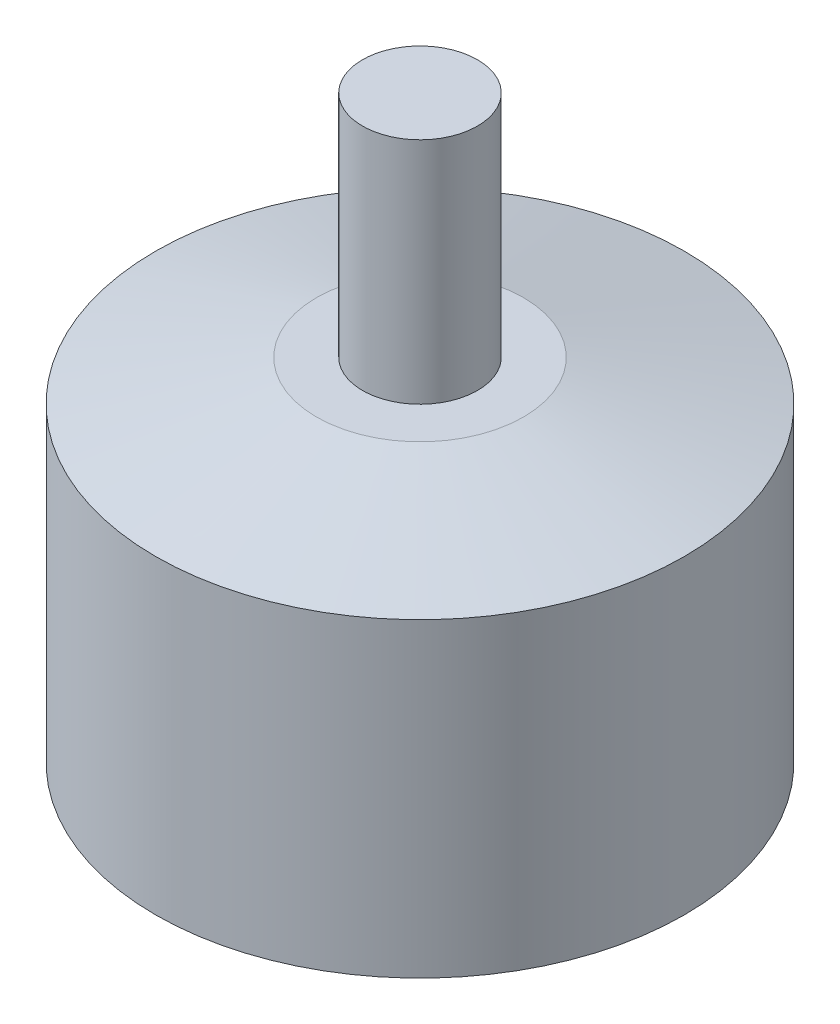
ISO-10303-21;
HEADER;
FILE_DESCRIPTION(('STEP AP214'),'2;1');
FILE_NAME('part.step','',(''),(''),'','','');
FILE_SCHEMA(('AUTOMOTIVE_DESIGN { 1 0 10303 214 1 1 1 1 }'));
ENDSEC;
DATA;
#1=APPLICATION_CONTEXT('core data for automotive mechanical design processes');
#2=APPLICATION_PROTOCOL_DEFINITION('international standard','automotive_design',2000,#1);
#3=PRODUCT_CONTEXT('',#1,'mechanical');
#4=PRODUCT('Part','Part','',(#3));
#5=PRODUCT_RELATED_PRODUCT_CATEGORY('part','',(#4));
#6=PRODUCT_DEFINITION_FORMATION('','',#4);
#7=PRODUCT_DEFINITION_CONTEXT('part definition',#1,'design');
#8=PRODUCT_DEFINITION('design','',#6,#7);
#9=PRODUCT_DEFINITION_SHAPE('','',#8);
#10=(LENGTH_UNIT() NAMED_UNIT(*) SI_UNIT(.MILLI.,.METRE.));
#11=(NAMED_UNIT(*) PLANE_ANGLE_UNIT() SI_UNIT($,.RADIAN.));
#12=(NAMED_UNIT(*) SI_UNIT($,.STERADIAN.) SOLID_ANGLE_UNIT());
#13=UNCERTAINTY_MEASURE_WITH_UNIT(LENGTH_MEASURE(1.E-05),#10,'distance_accuracy_value','');
#14=(GEOMETRIC_REPRESENTATION_CONTEXT(3) GLOBAL_UNCERTAINTY_ASSIGNED_CONTEXT((#13)) GLOBAL_UNIT_ASSIGNED_CONTEXT((#10,
#11,#12)) REPRESENTATION_CONTEXT('',''));
#15=CARTESIAN_POINT('',(0.,0.,0.));
#16=DIRECTION('',(0.,0.,1.));
#17=DIRECTION('',(1.,0.,0.));
#18=AXIS2_PLACEMENT_3D('',#15,#16,#17);
#19=CARTESIAN_POINT('',(0.,13.5,0.));
#20=DIRECTION('',(0.,-1.,0.));
#21=DIRECTION('',(0.,0.,-1.));
#22=AXIS2_PLACEMENT_3D('',#19,#20,#21);
#23=CONICAL_SURFACE('',#22,11.5,1.32581766366803);
#24=CARTESIAN_POINT('',(0.,15.25,0.));
#25=DIRECTION('',(0.,-1.,0.));
#26=DIRECTION('',(0.,0.,-1.));
#27=AXIS2_PLACEMENT_3D('',#24,#25,#26);
#28=CIRCLE('',#27,4.5);
#29=CARTESIAN_POINT('',(0.,15.25,-4.5));
#30=VERTEX_POINT('',#29);
#31=EDGE_CURVE('E60',#30,#30,#28,.T.);
#32=ORIENTED_EDGE('',*,*,#31,.T.);
#33=EDGE_LOOP('',(#32));
#34=FACE_BOUND('',#33,.T.);
#35=CARTESIAN_POINT('',(0.,13.5,0.));
#36=DIRECTION('',(0.,-1.,0.));
#37=DIRECTION('',(0.,0.,-1.));
#38=AXIS2_PLACEMENT_3D('',#35,#36,#37);
#39=CIRCLE('',#38,11.5);
#40=CARTESIAN_POINT('',(0.,13.5,-11.5));
#41=VERTEX_POINT('',#40);
#42=EDGE_CURVE('E10',#41,#41,#39,.T.);
#43=ORIENTED_EDGE('',*,*,#42,.F.);
#44=EDGE_LOOP('',(#43));
#45=FACE_BOUND('',#44,.T.);
#46=ADVANCED_FACE('F37',(#34,#45),#23,.T.);
#47=CARTESIAN_POINT('',(0.,15.25,0.));
#48=DIRECTION('',(0.,-1.,0.));
#49=DIRECTION('',(0.,0.,-1.));
#50=AXIS2_PLACEMENT_3D('',#47,#48,#49);
#51=CYLINDRICAL_SURFACE('',#50,11.5);
#52=ORIENTED_EDGE('',*,*,#42,.T.);
#53=EDGE_LOOP('',(#52));
#54=FACE_BOUND('',#53,.T.);
#55=CARTESIAN_POINT('',(0.,0.,0.));
#56=DIRECTION('',(0.,-1.,0.));
#57=DIRECTION('',(0.,0.,-1.));
#58=AXIS2_PLACEMENT_3D('',#55,#56,#57);
#59=CIRCLE('',#58,11.5);
#60=CARTESIAN_POINT('',(0.,0.,-11.5));
#61=VERTEX_POINT('',#60);
#62=EDGE_CURVE('E44',#61,#61,#59,.T.);
#63=ORIENTED_EDGE('',*,*,#62,.F.);
#64=EDGE_LOOP('',(#63));
#65=FACE_BOUND('',#64,.T.);
#66=ADVANCED_FACE('F85',(#54,#65),#51,.T.);
#67=CARTESIAN_POINT('',(0.,0.,0.));
#68=DIRECTION('',(0.,-1.,0.));
#69=DIRECTION('',(0.,0.,-1.));
#70=AXIS2_PLACEMENT_3D('',#67,#68,#69);
#71=PLANE('',#70);
#72=ORIENTED_EDGE('',*,*,#62,.T.);
#73=EDGE_LOOP('',(#72));
#74=FACE_BOUND('',#73,.T.);
#75=ADVANCED_FACE('F81',(#74),#71,.T.);
#76=CARTESIAN_POINT('',(0.,25.2106134128573,0.));
#77=DIRECTION('',(0.,-1.,0.));
#78=DIRECTION('',(0.,0.,-1.));
#79=AXIS2_PLACEMENT_3D('',#76,#77,#78);
#80=PLANE('',#79);
#81=CARTESIAN_POINT('',(0.,25.2106134128573,0.));
#82=DIRECTION('',(0.,-1.,0.));
#83=DIRECTION('',(0.,0.,-1.));
#84=AXIS2_PLACEMENT_3D('',#81,#82,#83);
#85=CIRCLE('',#84,2.5);
#86=CARTESIAN_POINT('',(0.,25.2106134128573,-2.5));
#87=VERTEX_POINT('',#86);
#88=EDGE_CURVE('E49',#87,#87,#85,.T.);
#89=ORIENTED_EDGE('',*,*,#88,.F.);
#90=EDGE_LOOP('',(#89));
#91=FACE_BOUND('',#90,.T.);
#92=ADVANCED_FACE('F75',(#91),#80,.F.);
#93=CARTESIAN_POINT('',(0.,15.25,0.));
#94=DIRECTION('',(0.,-1.,0.));
#95=DIRECTION('',(0.,0.,-1.));
#96=AXIS2_PLACEMENT_3D('',#93,#94,#95);
#97=CYLINDRICAL_SURFACE('',#96,2.5);
#98=ORIENTED_EDGE('',*,*,#88,.T.);
#99=EDGE_LOOP('',(#98));
#100=FACE_BOUND('',#99,.T.);
#101=CARTESIAN_POINT('',(0.,15.25,0.));
#102=DIRECTION('',(0.,-1.,0.));
#103=DIRECTION('',(0.,0.,-1.));
#104=AXIS2_PLACEMENT_3D('',#101,#102,#103);
#105=CIRCLE('',#104,2.5);
#106=CARTESIAN_POINT('',(0.,15.25,-2.5));
#107=VERTEX_POINT('',#106);
#108=EDGE_CURVE('E54',#107,#107,#105,.T.);
#109=ORIENTED_EDGE('',*,*,#108,.F.);
#110=EDGE_LOOP('',(#109));
#111=FACE_BOUND('',#110,.T.);
#112=ADVANCED_FACE('F70',(#100,#111),#97,.T.);
#113=CARTESIAN_POINT('',(0.,15.25,0.));
#114=DIRECTION('',(0.,-1.,0.));
#115=DIRECTION('',(0.,0.,-1.));
#116=AXIS2_PLACEMENT_3D('',#113,#114,#115);
#117=PLANE('',#116);
#118=ORIENTED_EDGE('',*,*,#31,.F.);
#119=EDGE_LOOP('',(#118));
#120=FACE_BOUND('',#119,.T.);
#121=ORIENTED_EDGE('',*,*,#108,.T.);
#122=EDGE_LOOP('',(#121));
#123=FACE_BOUND('',#122,.T.);
#124=ADVANCED_FACE('F67',(#120,#123),#117,.F.);
#125=CLOSED_SHELL('',(#46,#66,#75,#92,#112,#124));
#126=MANIFOLD_SOLID_BREP('B2',#125);
#127=ADVANCED_BREP_SHAPE_REPRESENTATION('',(#18,#126),#14);
#128=SHAPE_DEFINITION_REPRESENTATION(#9,#127);
ENDSEC;
END-ISO-10303-21;
